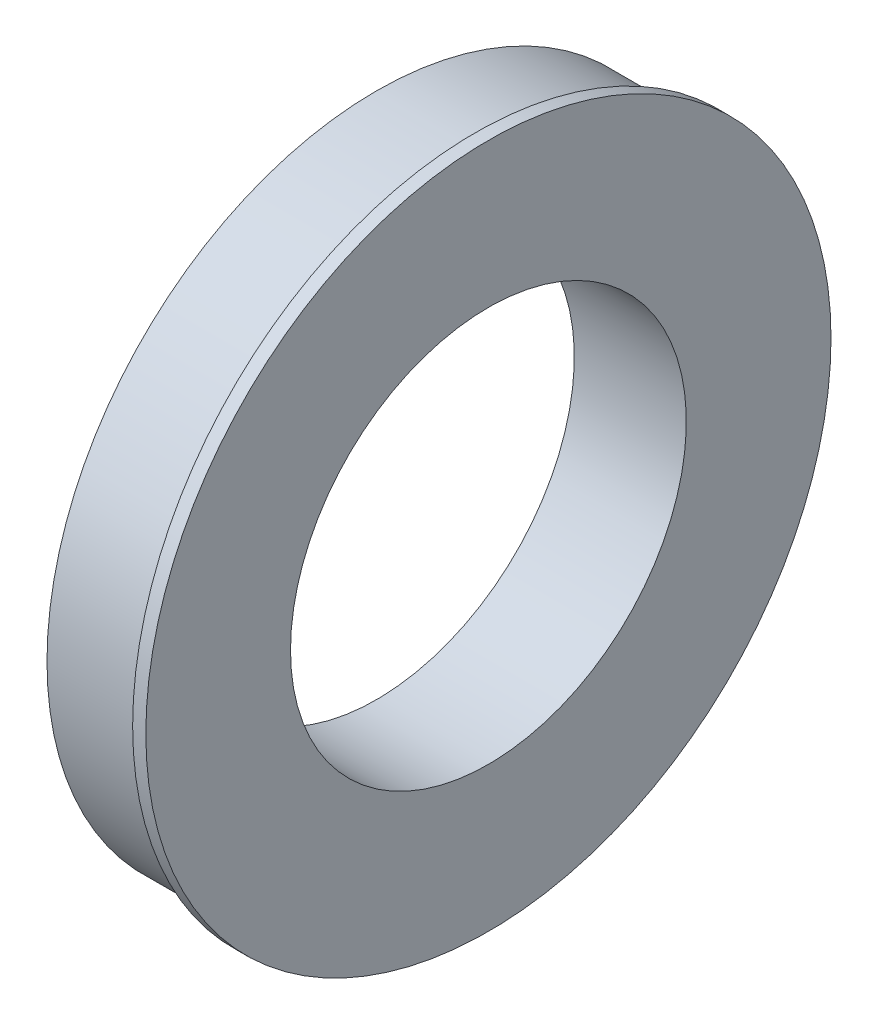
ISO-10303-21;
HEADER;
FILE_DESCRIPTION(('STEP AP214'),'2;1');
FILE_NAME('part.step','',(''),(''),'','','');
FILE_SCHEMA(('AUTOMOTIVE_DESIGN { 1 0 10303 214 1 1 1 1 }'));
ENDSEC;
DATA;
#1=APPLICATION_CONTEXT('core data for automotive mechanical design processes');
#2=APPLICATION_PROTOCOL_DEFINITION('international standard','automotive_design',2000,#1);
#3=PRODUCT_CONTEXT('',#1,'mechanical');
#4=PRODUCT('Part','Part','',(#3));
#5=PRODUCT_RELATED_PRODUCT_CATEGORY('part','',(#4));
#6=PRODUCT_DEFINITION_FORMATION('','',#4);
#7=PRODUCT_DEFINITION_CONTEXT('part definition',#1,'design');
#8=PRODUCT_DEFINITION('design','',#6,#7);
#9=PRODUCT_DEFINITION_SHAPE('','',#8);
#10=(LENGTH_UNIT() NAMED_UNIT(*) SI_UNIT(.MILLI.,.METRE.));
#11=(NAMED_UNIT(*) PLANE_ANGLE_UNIT() SI_UNIT($,.RADIAN.));
#12=(NAMED_UNIT(*) SI_UNIT($,.STERADIAN.) SOLID_ANGLE_UNIT());
#13=UNCERTAINTY_MEASURE_WITH_UNIT(LENGTH_MEASURE(1.E-05),#10,'distance_accuracy_value','');
#14=(GEOMETRIC_REPRESENTATION_CONTEXT(3) GLOBAL_UNCERTAINTY_ASSIGNED_CONTEXT((#13)) GLOBAL_UNIT_ASSIGNED_CONTEXT((#10,
#11,#12)) REPRESENTATION_CONTEXT('',''));
#15=CARTESIAN_POINT('',(0.,0.,0.));
#16=DIRECTION('',(0.,0.,1.));
#17=DIRECTION('',(1.,0.,0.));
#18=AXIS2_PLACEMENT_3D('',#15,#16,#17);
#19=CARTESIAN_POINT('',(0.,0.,0.));
#20=DIRECTION('',(1.,0.,0.));
#21=DIRECTION('',(0.,0.,-1.));
#22=AXIS2_PLACEMENT_3D('',#19,#20,#21);
#23=PLANE('',#22);
#24=CARTESIAN_POINT('',(0.,0.,0.));
#25=DIRECTION('',(1.,0.,0.));
#26=DIRECTION('',(0.,0.,-1.));
#27=AXIS2_PLACEMENT_3D('',#24,#25,#26);
#28=CIRCLE('',#27,63.5);
#29=CARTESIAN_POINT('',(0.,0.,63.5));
#30=VERTEX_POINT('',#29);
#31=EDGE_CURVE('E35',#30,#30,#28,.T.);
#32=ORIENTED_EDGE('',*,*,#31,.F.);
#33=EDGE_LOOP('',(#32));
#34=FACE_BOUND('',#33,.T.);
#35=CARTESIAN_POINT('',(0.,0.,0.));
#36=DIRECTION('',(1.,0.,0.));
#37=DIRECTION('',(0.,0.,-1.));
#38=AXIS2_PLACEMENT_3D('',#35,#36,#37);
#39=CIRCLE('',#38,38.15);
#40=CARTESIAN_POINT('',(0.,0.,38.15));
#41=VERTEX_POINT('',#40);
#42=EDGE_CURVE('E42',#41,#41,#39,.T.);
#43=ORIENTED_EDGE('',*,*,#42,.T.);
#44=EDGE_LOOP('',(#43));
#45=FACE_BOUND('',#44,.T.);
#46=ADVANCED_FACE('F31',(#34,#45),#23,.F.);
#47=CARTESIAN_POINT('',(19.05,0.,0.));
#48=DIRECTION('',(-1.,0.,0.));
#49=DIRECTION('',(0.,0.,1.));
#50=AXIS2_PLACEMENT_3D('',#47,#48,#49);
#51=CYLINDRICAL_SURFACE('',#50,63.5);
#52=CARTESIAN_POINT('',(19.05,0.,0.));
#53=DIRECTION('',(1.,0.,0.));
#54=DIRECTION('',(0.,0.,-1.));
#55=AXIS2_PLACEMENT_3D('',#52,#53,#54);
#56=CIRCLE('',#55,63.5);
#57=CARTESIAN_POINT('',(19.05,0.,63.5));
#58=VERTEX_POINT('',#57);
#59=EDGE_CURVE('E10',#58,#58,#56,.T.);
#60=CARTESIAN_POINT('',(19.05,0.,63.5));
#61=CARTESIAN_POINT('',(18.8515625,0.,63.5));
#62=CARTESIAN_POINT('',(18.653125,0.,63.5));
#63=CARTESIAN_POINT('',(18.25625,0.,63.5));
#64=CARTESIAN_POINT('',(18.0578125,0.,63.5));
#65=CARTESIAN_POINT('',(17.6609375,0.,63.5));
#66=CARTESIAN_POINT('',(17.4625,0.,63.5));
#67=CARTESIAN_POINT('',(17.065625,0.,63.5));
#68=CARTESIAN_POINT('',(16.8671875,0.,63.5));
#69=CARTESIAN_POINT('',(16.4703125,0.,63.5));
#70=CARTESIAN_POINT('',(16.271875,0.,63.5));
#71=CARTESIAN_POINT('',(15.875,0.,63.5));
#72=CARTESIAN_POINT('',(15.6765625,0.,63.5));
#73=CARTESIAN_POINT('',(15.2796875,0.,63.5));
#74=CARTESIAN_POINT('',(15.08125,0.,63.5));
#75=CARTESIAN_POINT('',(14.684375,0.,63.5));
#76=CARTESIAN_POINT('',(14.4859375,0.,63.5));
#77=CARTESIAN_POINT('',(14.0890625,0.,63.5));
#78=CARTESIAN_POINT('',(13.890625,0.,63.5));
#79=CARTESIAN_POINT('',(13.49375,0.,63.5));
#80=CARTESIAN_POINT('',(13.2953125,0.,63.5));
#81=CARTESIAN_POINT('',(12.8984375,0.,63.5));
#82=CARTESIAN_POINT('',(12.7,0.,63.5));
#83=CARTESIAN_POINT('',(12.303125,0.,63.5));
#84=CARTESIAN_POINT('',(12.1046875,0.,63.5));
#85=CARTESIAN_POINT('',(11.7078125,0.,63.5));
#86=CARTESIAN_POINT('',(11.509375,0.,63.5));
#87=CARTESIAN_POINT('',(11.1125,0.,63.5));
#88=CARTESIAN_POINT('',(10.9140625,0.,63.5));
#89=CARTESIAN_POINT('',(10.5171875,0.,63.5));
#90=CARTESIAN_POINT('',(10.31875,0.,63.5));
#91=CARTESIAN_POINT('',(9.921875,0.,63.5));
#92=CARTESIAN_POINT('',(9.7234375,0.,63.5));
#93=CARTESIAN_POINT('',(9.3265625,0.,63.5));
#94=CARTESIAN_POINT('',(9.128125,0.,63.5));
#95=CARTESIAN_POINT('',(8.73125,0.,63.5));
#96=CARTESIAN_POINT('',(8.5328125,0.,63.5));
#97=CARTESIAN_POINT('',(8.1359375,0.,63.5));
#98=CARTESIAN_POINT('',(7.9375,0.,63.5));
#99=CARTESIAN_POINT('',(7.540625,0.,63.5));
#100=CARTESIAN_POINT('',(7.3421875,0.,63.5));
#101=CARTESIAN_POINT('',(6.9453125,0.,63.5));
#102=CARTESIAN_POINT('',(6.746875,0.,63.5));
#103=CARTESIAN_POINT('',(6.35,0.,63.5));
#104=CARTESIAN_POINT('',(6.1515625,0.,63.5));
#105=CARTESIAN_POINT('',(5.7546875,0.,63.5));
#106=CARTESIAN_POINT('',(5.55625,0.,63.5));
#107=CARTESIAN_POINT('',(5.159375,0.,63.5));
#108=CARTESIAN_POINT('',(4.9609375,0.,63.5));
#109=CARTESIAN_POINT('',(4.5640625,0.,63.5));
#110=CARTESIAN_POINT('',(4.365625,0.,63.5));
#111=CARTESIAN_POINT('',(3.96875,0.,63.5));
#112=CARTESIAN_POINT('',(3.7703125,0.,63.5));
#113=CARTESIAN_POINT('',(3.3734375,0.,63.5));
#114=CARTESIAN_POINT('',(3.175,0.,63.5));
#115=CARTESIAN_POINT('',(2.778125,0.,63.5));
#116=CARTESIAN_POINT('',(2.5796875,0.,63.5));
#117=CARTESIAN_POINT('',(2.1828125,0.,63.5));
#118=CARTESIAN_POINT('',(1.984375,0.,63.5));
#119=CARTESIAN_POINT('',(1.5875,0.,63.5));
#120=CARTESIAN_POINT('',(1.3890625,0.,63.5));
#121=CARTESIAN_POINT('',(0.992187500000001,0.,63.5));
#122=CARTESIAN_POINT('',(0.793750000000001,0.,63.5));
#123=CARTESIAN_POINT('',(0.396875,0.,63.5));
#124=CARTESIAN_POINT('',(0.1984375,0.,63.5));
#125=CARTESIAN_POINT('',(0.,0.,63.5));
#126=B_SPLINE_CURVE_WITH_KNOTS('',3,(#60,#61,#62,#63,#64,#65,#66,#67,#68,#69,#70,#71,#72,#73,
#74,#75,#76,#77,#78,#79,#80,#81,#82,#83,#84,#85,#86,#87,#88,#89,#90,#91,#92,#93,#94,#95,#96,#97,
#98,#99,#100,#101,#102,#103,#104,#105,#106,#107,#108,#109,#110,#111,#112,#113,#114,#115,#116,
#117,#118,#119,#120,#121,#122,#123,#124,#125),.UNSPECIFIED.,.F.,.F.,(4,2,2,2,2,2,2,2,2,2,2,2,2,
2,2,2,2,2,2,2,2,2,2,2,2,2,2,2,2,2,2,2,4),(0.,0.5953125,1.190625,1.7859375,2.38125,2.9765625,
3.571875,4.1671875,4.7625,5.3578125,5.953125,6.5484375,7.14375,7.7390625,8.334375,8.9296875,
9.525,10.1203125,10.715625,11.3109375,11.90625,12.5015625,13.096875,13.6921875,14.2875,
14.8828125,15.478125,16.0734375,16.66875,17.2640625,17.859375,18.4546875,19.05),.UNSPECIFIED.);
#127=EDGE_CURVE('BSEAM33',#58,#30,#126,.T.);
#128=ORIENTED_EDGE('',*,*,#59,.F.);
#129=ORIENTED_EDGE('',*,*,#31,.T.);
#130=ORIENTED_EDGE('',*,*,#127,.T.);
#131=ORIENTED_EDGE('',*,*,#127,.F.);
#132=EDGE_LOOP('',(#128,#130,#129,#131));
#133=FACE_BOUND('',#132,.T.);
#134=ADVANCED_FACE('F33',(#133),#51,.T.);
#135=CARTESIAN_POINT('',(19.05,0.,0.));
#136=DIRECTION('',(-1.,0.,0.));
#137=DIRECTION('',(0.,0.,1.));
#138=AXIS2_PLACEMENT_3D('',#135,#136,#137);
#139=CYLINDRICAL_SURFACE('',#138,38.15);
#140=CARTESIAN_POINT('',(21.59,0.,0.));
#141=DIRECTION('',(1.,0.,0.));
#142=DIRECTION('',(0.,0.,-1.));
#143=AXIS2_PLACEMENT_3D('',#140,#141,#142);
#144=CIRCLE('',#143,38.15);
#145=CARTESIAN_POINT('',(21.59,0.,38.15));
#146=VERTEX_POINT('',#145);
#147=EDGE_CURVE('E50',#146,#146,#144,.T.);
#148=CARTESIAN_POINT('',(0.,0.,38.15));
#149=CARTESIAN_POINT('',(0.224895833333333,0.,38.15));
#150=CARTESIAN_POINT('',(0.449791666666667,0.,38.15));
#151=CARTESIAN_POINT('',(0.899583333333333,0.,38.15));
#152=CARTESIAN_POINT('',(1.12447916666667,0.,38.15));
#153=CARTESIAN_POINT('',(1.57427083333333,0.,38.15));
#154=CARTESIAN_POINT('',(1.79916666666667,0.,38.15));
#155=CARTESIAN_POINT('',(2.24895833333333,0.,38.15));
#156=CARTESIAN_POINT('',(2.47385416666667,0.,38.15));
#157=CARTESIAN_POINT('',(2.92364583333333,0.,38.15));
#158=CARTESIAN_POINT('',(3.14854166666667,0.,38.15));
#159=CARTESIAN_POINT('',(3.59833333333333,0.,38.15));
#160=CARTESIAN_POINT('',(3.82322916666667,0.,38.15));
#161=CARTESIAN_POINT('',(4.27302083333333,0.,38.15));
#162=CARTESIAN_POINT('',(4.49791666666667,0.,38.15));
#163=CARTESIAN_POINT('',(4.94770833333333,0.,38.15));
#164=CARTESIAN_POINT('',(5.17260416666667,0.,38.15));
#165=CARTESIAN_POINT('',(5.62239583333333,0.,38.15));
#166=CARTESIAN_POINT('',(5.84729166666667,0.,38.15));
#167=CARTESIAN_POINT('',(6.29708333333333,0.,38.15));
#168=CARTESIAN_POINT('',(6.52197916666667,0.,38.15));
#169=CARTESIAN_POINT('',(6.97177083333333,0.,38.15));
#170=CARTESIAN_POINT('',(7.19666666666667,0.,38.15));
#171=CARTESIAN_POINT('',(7.64645833333333,0.,38.15));
#172=CARTESIAN_POINT('',(7.87135416666667,0.,38.15));
#173=CARTESIAN_POINT('',(8.32114583333333,0.,38.15));
#174=CARTESIAN_POINT('',(8.54604166666667,0.,38.15));
#175=CARTESIAN_POINT('',(8.99583333333334,0.,38.15));
#176=CARTESIAN_POINT('',(9.22072916666667,0.,38.15));
#177=CARTESIAN_POINT('',(9.67052083333333,0.,38.15));
#178=CARTESIAN_POINT('',(9.89541666666667,0.,38.15));
#179=CARTESIAN_POINT('',(10.3452083333333,0.,38.15));
#180=CARTESIAN_POINT('',(10.5701041666667,0.,38.15));
#181=CARTESIAN_POINT('',(11.0198958333333,0.,38.15));
#182=CARTESIAN_POINT('',(11.2447916666667,0.,38.15));
#183=CARTESIAN_POINT('',(11.6945833333333,0.,38.15));
#184=CARTESIAN_POINT('',(11.9194791666667,0.,38.15));
#185=CARTESIAN_POINT('',(12.3692708333333,0.,38.15));
#186=CARTESIAN_POINT('',(12.5941666666667,0.,38.15));
#187=CARTESIAN_POINT('',(13.0439583333333,0.,38.15));
#188=CARTESIAN_POINT('',(13.2688541666667,0.,38.15));
#189=CARTESIAN_POINT('',(13.7186458333333,0.,38.15));
#190=CARTESIAN_POINT('',(13.9435416666667,0.,38.15));
#191=CARTESIAN_POINT('',(14.3933333333333,0.,38.15));
#192=CARTESIAN_POINT('',(14.6182291666667,0.,38.15));
#193=CARTESIAN_POINT('',(15.0680208333333,0.,38.15));
#194=CARTESIAN_POINT('',(15.2929166666667,0.,38.15));
#195=CARTESIAN_POINT('',(15.7427083333333,0.,38.15));
#196=CARTESIAN_POINT('',(15.9676041666667,0.,38.15));
#197=CARTESIAN_POINT('',(16.4173958333333,0.,38.15));
#198=CARTESIAN_POINT('',(16.6422916666667,0.,38.15));
#199=CARTESIAN_POINT('',(17.0920833333333,0.,38.15));
#200=CARTESIAN_POINT('',(17.3169791666667,0.,38.15));
#201=CARTESIAN_POINT('',(17.7667708333333,0.,38.15));
#202=CARTESIAN_POINT('',(17.9916666666667,0.,38.15));
#203=CARTESIAN_POINT('',(18.4414583333333,0.,38.15));
#204=CARTESIAN_POINT('',(18.6663541666667,0.,38.15));
#205=CARTESIAN_POINT('',(19.1161458333333,0.,38.15));
#206=CARTESIAN_POINT('',(19.3410416666667,0.,38.15));
#207=CARTESIAN_POINT('',(19.7908333333333,0.,38.15));
#208=CARTESIAN_POINT('',(20.0157291666667,0.,38.15));
#209=CARTESIAN_POINT('',(20.4655208333333,0.,38.15));
#210=CARTESIAN_POINT('',(20.6904166666667,0.,38.15));
#211=CARTESIAN_POINT('',(21.1402083333333,0.,38.15));
#212=CARTESIAN_POINT('',(21.3651041666667,0.,38.15));
#213=CARTESIAN_POINT('',(21.59,0.,38.15));
#214=B_SPLINE_CURVE_WITH_KNOTS('',3,(#148,#149,#150,#151,#152,#153,#154,#155,#156,#157,#158,
#159,#160,#161,#162,#163,#164,#165,#166,#167,#168,#169,#170,#171,#172,#173,#174,#175,#176,#177,
#178,#179,#180,#181,#182,#183,#184,#185,#186,#187,#188,#189,#190,#191,#192,#193,#194,#195,#196,
#197,#198,#199,#200,#201,#202,#203,#204,#205,#206,#207,#208,#209,#210,#211,#212,#213),
.UNSPECIFIED.,.F.,.F.,(4,2,2,2,2,2,2,2,2,2,2,2,2,2,2,2,2,2,2,2,2,2,2,2,2,2,2,2,2,2,2,2,4),(0.,
0.6746875,1.349375,2.0240625,2.69875,3.3734375,4.048125,4.7228125,5.3975,6.0721875,6.746875,
7.4215625,8.09625,8.7709375,9.445625,10.1203125,10.795,11.4696875,12.144375,12.8190625,13.49375,
14.1684375,14.843125,15.5178125,16.1925,16.8671875,17.541875,18.2165625,18.89125,19.5659375,
20.240625,20.9153125,21.59),.UNSPECIFIED.);
#215=EDGE_CURVE('BSEAM56',#41,#146,#214,.T.);
#216=ORIENTED_EDGE('',*,*,#42,.F.);
#217=ORIENTED_EDGE('',*,*,#147,.T.);
#218=ORIENTED_EDGE('',*,*,#215,.T.);
#219=ORIENTED_EDGE('',*,*,#215,.F.);
#220=EDGE_LOOP('',(#216,#218,#217,#219));
#221=FACE_BOUND('',#220,.T.);
#222=ADVANCED_FACE('F56',(#221),#139,.F.);
#223=CARTESIAN_POINT('',(21.59,0.,0.));
#224=DIRECTION('',(1.,0.,0.));
#225=DIRECTION('',(0.,0.,-1.));
#226=AXIS2_PLACEMENT_3D('',#223,#224,#225);
#227=PLANE('',#226);
#228=CARTESIAN_POINT('',(21.59,0.,0.));
#229=DIRECTION('',(1.,0.,0.));
#230=DIRECTION('',(0.,0.,-1.));
#231=AXIS2_PLACEMENT_3D('',#228,#229,#230);
#232=CIRCLE('',#231,66.04);
#233=CARTESIAN_POINT('',(21.59,0.,-66.04));
#234=VERTEX_POINT('',#233);
#235=EDGE_CURVE('E46',#234,#234,#232,.T.);
#236=ORIENTED_EDGE('',*,*,#235,.T.);
#237=EDGE_LOOP('',(#236));
#238=FACE_BOUND('',#237,.T.);
#239=ORIENTED_EDGE('',*,*,#147,.F.);
#240=EDGE_LOOP('',(#239));
#241=FACE_BOUND('',#240,.T.);
#242=ADVANCED_FACE('F58',(#238,#241),#227,.T.);
#243=CARTESIAN_POINT('',(19.05,0.,0.));
#244=DIRECTION('',(1.,0.,0.));
#245=DIRECTION('',(0.,0.,-1.));
#246=AXIS2_PLACEMENT_3D('',#243,#244,#245);
#247=PLANE('',#246);
#248=ORIENTED_EDGE('',*,*,#59,.T.);
#249=EDGE_LOOP('',(#248));
#250=FACE_BOUND('',#249,.T.);
#251=CARTESIAN_POINT('',(19.05,0.,0.));
#252=DIRECTION('',(1.,0.,0.));
#253=DIRECTION('',(0.,0.,-1.));
#254=AXIS2_PLACEMENT_3D('',#251,#252,#253);
#255=CIRCLE('',#254,66.04);
#256=CARTESIAN_POINT('',(19.05,0.,-66.04));
#257=VERTEX_POINT('',#256);
#258=EDGE_CURVE('E47',#257,#257,#255,.T.);
#259=ORIENTED_EDGE('',*,*,#258,.F.);
#260=EDGE_LOOP('',(#259));
#261=FACE_BOUND('',#260,.T.);
#262=ADVANCED_FACE('F60',(#250,#261),#247,.F.);
#263=CARTESIAN_POINT('',(21.59,0.,0.));
#264=DIRECTION('',(-1.,0.,0.));
#265=DIRECTION('',(0.,0.,1.));
#266=AXIS2_PLACEMENT_3D('',#263,#264,#265);
#267=CYLINDRICAL_SURFACE('',#266,66.04);
#268=ORIENTED_EDGE('',*,*,#235,.F.);
#269=EDGE_LOOP('',(#268));
#270=FACE_BOUND('',#269,.T.);
#271=ORIENTED_EDGE('',*,*,#258,.T.);
#272=EDGE_LOOP('',(#271));
#273=FACE_BOUND('',#272,.T.);
#274=ADVANCED_FACE('F67',(#270,#273),#267,.T.);
#275=CLOSED_SHELL('',(#46,#134,#222,#242,#262,#274));
#276=MANIFOLD_SOLID_BREP('B2',#275);
#277=ADVANCED_BREP_SHAPE_REPRESENTATION('',(#18,#276),#14);
#278=SHAPE_DEFINITION_REPRESENTATION(#9,#277);
ENDSEC;
END-ISO-10303-21;
